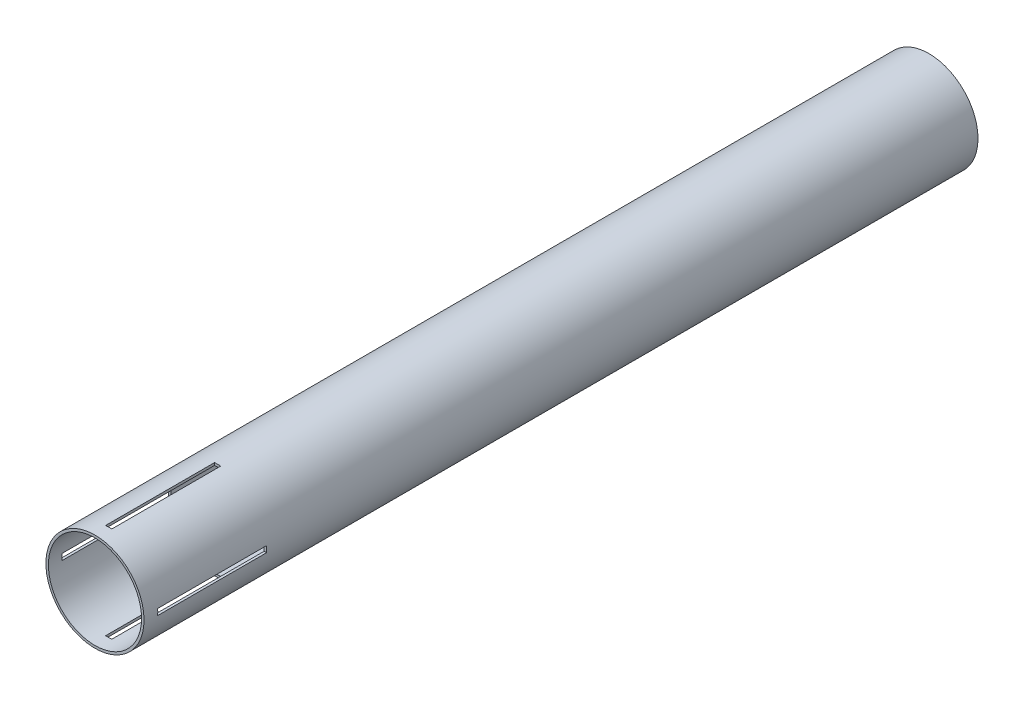
ISO-10303-21;
HEADER;
FILE_DESCRIPTION(('STEP AP214'),'2;1');
FILE_NAME('part.step','',(''),(''),'','','');
FILE_SCHEMA(('AUTOMOTIVE_DESIGN { 1 0 10303 214 1 1 1 1 }'));
ENDSEC;
DATA;
#1=APPLICATION_CONTEXT('core data for automotive mechanical design processes');
#2=APPLICATION_PROTOCOL_DEFINITION('international standard','automotive_design',2000,#1);
#3=PRODUCT_CONTEXT('',#1,'mechanical');
#4=PRODUCT('Part','Part','',(#3));
#5=PRODUCT_RELATED_PRODUCT_CATEGORY('part','',(#4));
#6=PRODUCT_DEFINITION_FORMATION('','',#4);
#7=PRODUCT_DEFINITION_CONTEXT('part definition',#1,'design');
#8=PRODUCT_DEFINITION('design','',#6,#7);
#9=PRODUCT_DEFINITION_SHAPE('','',#8);
#10=(LENGTH_UNIT() NAMED_UNIT(*) SI_UNIT(.MILLI.,.METRE.));
#11=(NAMED_UNIT(*) PLANE_ANGLE_UNIT() SI_UNIT($,.RADIAN.));
#12=(NAMED_UNIT(*) SI_UNIT($,.STERADIAN.) SOLID_ANGLE_UNIT());
#13=UNCERTAINTY_MEASURE_WITH_UNIT(LENGTH_MEASURE(1.E-05),#10,'distance_accuracy_value','');
#14=(GEOMETRIC_REPRESENTATION_CONTEXT(3) GLOBAL_UNCERTAINTY_ASSIGNED_CONTEXT((#13)) GLOBAL_UNIT_ASSIGNED_CONTEXT((#10,
#11,#12)) REPRESENTATION_CONTEXT('',''));
#15=CARTESIAN_POINT('',(0.,0.,0.));
#16=DIRECTION('',(0.,0.,1.));
#17=DIRECTION('',(1.,0.,0.));
#18=AXIS2_PLACEMENT_3D('',#15,#16,#17);
#19=CARTESIAN_POINT('',(-50.7006841669814,-3.175,736.6));
#20=DIRECTION('',(0.,-1.,0.));
#21=DIRECTION('',(0.,0.,-1.));
#22=AXIS2_PLACEMENT_3D('',#19,#20,#21);
#23=PLANE('',#22);
#24=DIRECTION('',(1.,0.,0.));
#25=VECTOR('',#24,1.);
#26=CARTESIAN_POINT('',(-50.7006841669814,-3.175,849.376));
#27=LINE('',#26,#25);
#28=CARTESIAN_POINT('',(-50.7006841669814,-3.175,849.376));
#29=VERTEX_POINT('',#28);
#30=CARTESIAN_POINT('',(-48.1554459537029,-3.175,849.376));
#31=VERTEX_POINT('',#30);
#32=EDGE_CURVE('E60',#29,#31,#27,.T.);
#33=ORIENTED_EDGE('',*,*,#32,.T.);
#34=DIRECTION('',(0.,0.,1.));
#35=VECTOR('',#34,1.);
#36=CARTESIAN_POINT('',(-48.1554459537029,-3.175,736.6));
#37=LINE('',#36,#35);
#38=CARTESIAN_POINT('',(-48.1554459537029,-3.175,736.6));
#39=VERTEX_POINT('',#38);
#40=EDGE_CURVE('E195',#39,#31,#37,.T.);
#41=ORIENTED_EDGE('',*,*,#40,.F.);
#42=DIRECTION('',(1.,0.,0.));
#43=VECTOR('',#42,1.);
#44=CARTESIAN_POINT('',(-50.7006841669814,-3.175,736.6));
#45=LINE('',#44,#43);
#46=CARTESIAN_POINT('',(-50.7006841669814,-3.175,736.6));
#47=VERTEX_POINT('',#46);
#48=EDGE_CURVE('E230',#47,#39,#45,.T.);
#49=ORIENTED_EDGE('',*,*,#48,.F.);
#50=DIRECTION('',(0.,0.,1.));
#51=VECTOR('',#50,1.);
#52=CARTESIAN_POINT('',(-50.7006841669814,-3.175,736.6));
#53=LINE('',#52,#51);
#54=EDGE_CURVE('E55',#47,#29,#53,.T.);
#55=ORIENTED_EDGE('',*,*,#54,.T.);
#56=EDGE_LOOP('',(#33,#41,#49,#55));
#57=FACE_BOUND('',#56,.T.);
#58=ADVANCED_FACE('F39',(#57),#23,.F.);
#59=CARTESIAN_POINT('',(-50.7006841669814,3.175,736.6));
#60=DIRECTION('',(0.,1.,0.));
#61=DIRECTION('',(0.,0.,1.));
#62=AXIS2_PLACEMENT_3D('',#59,#60,#61);
#63=PLANE('',#62);
#64=DIRECTION('',(-1.,0.,0.));
#65=VECTOR('',#64,1.);
#66=CARTESIAN_POINT('',(-48.1554459537029,3.175,849.376));
#67=LINE('',#66,#65);
#68=CARTESIAN_POINT('',(-48.1554459537029,3.175,849.376));
#69=VERTEX_POINT('',#68);
#70=CARTESIAN_POINT('',(-50.7006841669814,3.175,849.376));
#71=VERTEX_POINT('',#70);
#72=EDGE_CURVE('E332',#69,#71,#67,.T.);
#73=ORIENTED_EDGE('',*,*,#72,.T.);
#74=DIRECTION('',(0.,0.,1.));
#75=VECTOR('',#74,1.);
#76=CARTESIAN_POINT('',(-50.7006841669814,3.175,736.6));
#77=LINE('',#76,#75);
#78=CARTESIAN_POINT('',(-50.7006841669814,3.175,736.6));
#79=VERTEX_POINT('',#78);
#80=EDGE_CURVE('E238',#79,#71,#77,.T.);
#81=ORIENTED_EDGE('',*,*,#80,.F.);
#82=DIRECTION('',(-1.,0.,0.));
#83=VECTOR('',#82,1.);
#84=CARTESIAN_POINT('',(-50.7006841669814,3.175,736.6));
#85=LINE('',#84,#83);
#86=CARTESIAN_POINT('',(-48.1554459537029,3.175,736.6));
#87=VERTEX_POINT('',#86);
#88=EDGE_CURVE('E222',#87,#79,#85,.T.);
#89=ORIENTED_EDGE('',*,*,#88,.F.);
#90=DIRECTION('',(0.,0.,1.));
#91=VECTOR('',#90,1.);
#92=CARTESIAN_POINT('',(-48.1554459537029,3.175,736.6));
#93=LINE('',#92,#91);
#94=EDGE_CURVE('E233',#87,#69,#93,.T.);
#95=ORIENTED_EDGE('',*,*,#94,.T.);
#96=EDGE_LOOP('',(#73,#81,#89,#95));
#97=FACE_BOUND('',#96,.T.);
#98=ADVANCED_FACE('F349',(#97),#63,.F.);
#99=CARTESIAN_POINT('',(-3.17500000000001,-48.1554459537029,736.6));
#100=DIRECTION('',(-1.,0.,0.));
#101=DIRECTION('',(0.,-1.,0.));
#102=AXIS2_PLACEMENT_3D('',#99,#100,#101);
#103=PLANE('',#102);
#104=DIRECTION('',(0.,-1.,0.));
#105=VECTOR('',#104,1.);
#106=CARTESIAN_POINT('',(-3.17500000000001,-48.1554459537029,849.376));
#107=LINE('',#106,#105);
#108=CARTESIAN_POINT('',(-3.17500000000001,-48.1554459537029,849.376));
#109=VERTEX_POINT('',#108);
#110=CARTESIAN_POINT('',(-3.17500000000001,-50.7006841669814,849.376));
#111=VERTEX_POINT('',#110);
#112=EDGE_CURVE('E315',#109,#111,#107,.T.);
#113=ORIENTED_EDGE('',*,*,#112,.T.);
#114=DIRECTION('',(0.,0.,1.));
#115=VECTOR('',#114,1.);
#116=CARTESIAN_POINT('',(-3.17500000000001,-50.7006841669814,736.6));
#117=LINE('',#116,#115);
#118=CARTESIAN_POINT('',(-3.17500000000001,-50.7006841669814,736.6));
#119=VERTEX_POINT('',#118);
#120=EDGE_CURVE('E279',#119,#111,#117,.T.);
#121=ORIENTED_EDGE('',*,*,#120,.F.);
#122=DIRECTION('',(0.,-1.,0.));
#123=VECTOR('',#122,1.);
#124=CARTESIAN_POINT('',(-3.17500000000001,-48.1554459537029,736.6));
#125=LINE('',#124,#123);
#126=CARTESIAN_POINT('',(-3.17500000000001,-48.1554459537029,736.6));
#127=VERTEX_POINT('',#126);
#128=EDGE_CURVE('E171',#127,#119,#125,.T.);
#129=ORIENTED_EDGE('',*,*,#128,.F.);
#130=DIRECTION('',(0.,0.,1.));
#131=VECTOR('',#130,1.);
#132=CARTESIAN_POINT('',(-3.17500000000001,-48.1554459537029,736.6));
#133=LINE('',#132,#131);
#134=EDGE_CURVE('E185',#127,#109,#133,.T.);
#135=ORIENTED_EDGE('',*,*,#134,.T.);
#136=EDGE_LOOP('',(#113,#121,#129,#135));
#137=FACE_BOUND('',#136,.T.);
#138=ADVANCED_FACE('F359',(#137),#103,.F.);
#139=CARTESIAN_POINT('',(3.17500000000001,-48.1554459537029,736.6));
#140=DIRECTION('',(1.,0.,0.));
#141=DIRECTION('',(0.,1.,0.));
#142=AXIS2_PLACEMENT_3D('',#139,#140,#141);
#143=PLANE('',#142);
#144=DIRECTION('',(0.,1.,0.));
#145=VECTOR('',#144,1.);
#146=CARTESIAN_POINT('',(3.17500000000001,-50.7006841669814,849.376));
#147=LINE('',#146,#145);
#148=CARTESIAN_POINT('',(3.17500000000001,-50.7006841669814,849.376));
#149=VERTEX_POINT('',#148);
#150=CARTESIAN_POINT('',(3.175,-48.1554459537029,849.376));
#151=VERTEX_POINT('',#150);
#152=EDGE_CURVE('E322',#149,#151,#147,.T.);
#153=ORIENTED_EDGE('',*,*,#152,.T.);
#154=DIRECTION('',(0.,0.,1.));
#155=VECTOR('',#154,1.);
#156=CARTESIAN_POINT('',(3.175,-48.1554459537029,736.6));
#157=LINE('',#156,#155);
#158=CARTESIAN_POINT('',(3.175,-48.1554459537029,736.6));
#159=VERTEX_POINT('',#158);
#160=EDGE_CURVE('E160',#159,#151,#157,.T.);
#161=ORIENTED_EDGE('',*,*,#160,.F.);
#162=DIRECTION('',(0.,1.,0.));
#163=VECTOR('',#162,1.);
#164=CARTESIAN_POINT('',(3.17500000000001,-48.1554459537029,736.6));
#165=LINE('',#164,#163);
#166=CARTESIAN_POINT('',(3.17500000000001,-50.7006841669814,736.6));
#167=VERTEX_POINT('',#166);
#168=EDGE_CURVE('E153',#167,#159,#165,.T.);
#169=ORIENTED_EDGE('',*,*,#168,.F.);
#170=DIRECTION('',(0.,0.,1.));
#171=VECTOR('',#170,1.);
#172=CARTESIAN_POINT('',(3.17500000000001,-50.7006841669814,736.6));
#173=LINE('',#172,#171);
#174=EDGE_CURVE('E157',#167,#149,#173,.T.);
#175=ORIENTED_EDGE('',*,*,#174,.T.);
#176=EDGE_LOOP('',(#153,#161,#169,#175));
#177=FACE_BOUND('',#176,.T.);
#178=ADVANCED_FACE('F155',(#177),#143,.F.);
#179=CARTESIAN_POINT('',(48.1554459537029,-3.175,736.6));
#180=DIRECTION('',(0.,-1.,0.));
#181=DIRECTION('',(0.,0.,-1.));
#182=AXIS2_PLACEMENT_3D('',#179,#180,#181);
#183=PLANE('',#182);
#184=DIRECTION('',(1.,0.,0.));
#185=VECTOR('',#184,1.);
#186=CARTESIAN_POINT('',(48.1554459537029,-3.17500000000002,849.376));
#187=LINE('',#186,#185);
#188=CARTESIAN_POINT('',(48.1554459537029,-3.17500000000002,849.376));
#189=VERTEX_POINT('',#188);
#190=CARTESIAN_POINT('',(50.7006841669814,-3.175,849.376));
#191=VERTEX_POINT('',#190);
#192=EDGE_CURVE('E301',#189,#191,#187,.T.);
#193=ORIENTED_EDGE('',*,*,#192,.T.);
#194=DIRECTION('',(0.,0.,1.));
#195=VECTOR('',#194,1.);
#196=CARTESIAN_POINT('',(50.7006841669814,-3.175,736.6));
#197=LINE('',#196,#195);
#198=CARTESIAN_POINT('',(50.7006841669814,-3.175,736.6));
#199=VERTEX_POINT('',#198);
#200=EDGE_CURVE('E223',#199,#191,#197,.T.);
#201=ORIENTED_EDGE('',*,*,#200,.F.);
#202=DIRECTION('',(1.,0.,0.));
#203=VECTOR('',#202,1.);
#204=CARTESIAN_POINT('',(48.1554459537029,-3.175,736.6));
#205=LINE('',#204,#203);
#206=CARTESIAN_POINT('',(48.1554459537029,-3.17500000000002,736.6));
#207=VERTEX_POINT('',#206);
#208=EDGE_CURVE('E255',#207,#199,#205,.T.);
#209=ORIENTED_EDGE('',*,*,#208,.F.);
#210=DIRECTION('',(0.,0.,1.));
#211=VECTOR('',#210,1.);
#212=CARTESIAN_POINT('',(48.1554459537029,-3.17500000000002,736.6));
#213=LINE('',#212,#211);
#214=EDGE_CURVE('E263',#207,#189,#213,.T.);
#215=ORIENTED_EDGE('',*,*,#214,.T.);
#216=EDGE_LOOP('',(#193,#201,#209,#215));
#217=FACE_BOUND('',#216,.T.);
#218=ADVANCED_FACE('F368',(#217),#183,.F.);
#219=CARTESIAN_POINT('',(48.1554459537029,3.175,736.6));
#220=DIRECTION('',(0.,1.,0.));
#221=DIRECTION('',(0.,0.,1.));
#222=AXIS2_PLACEMENT_3D('',#219,#220,#221);
#223=PLANE('',#222);
#224=DIRECTION('',(-1.,0.,0.));
#225=VECTOR('',#224,1.);
#226=CARTESIAN_POINT('',(50.7006841669814,3.175,849.376));
#227=LINE('',#226,#225);
#228=CARTESIAN_POINT('',(50.7006841669814,3.175,849.376));
#229=VERTEX_POINT('',#228);
#230=CARTESIAN_POINT('',(48.1554459537029,3.175,849.376));
#231=VERTEX_POINT('',#230);
#232=EDGE_CURVE('E308',#229,#231,#227,.T.);
#233=ORIENTED_EDGE('',*,*,#232,.T.);
#234=DIRECTION('',(0.,0.,1.));
#235=VECTOR('',#234,1.);
#236=CARTESIAN_POINT('',(48.1554459537029,3.175,736.6));
#237=LINE('',#236,#235);
#238=CARTESIAN_POINT('',(48.1554459537029,3.175,736.6));
#239=VERTEX_POINT('',#238);
#240=EDGE_CURVE('E266',#239,#231,#237,.T.);
#241=ORIENTED_EDGE('',*,*,#240,.F.);
#242=DIRECTION('',(-1.,0.,0.));
#243=VECTOR('',#242,1.);
#244=CARTESIAN_POINT('',(48.1554459537029,3.175,736.6));
#245=LINE('',#244,#243);
#246=CARTESIAN_POINT('',(50.7006841669814,3.175,736.6));
#247=VERTEX_POINT('',#246);
#248=EDGE_CURVE('E248',#247,#239,#245,.T.);
#249=ORIENTED_EDGE('',*,*,#248,.F.);
#250=DIRECTION('',(0.,0.,1.));
#251=VECTOR('',#250,1.);
#252=CARTESIAN_POINT('',(50.7006841669814,3.175,736.6));
#253=LINE('',#252,#251);
#254=EDGE_CURVE('E259',#247,#229,#253,.T.);
#255=ORIENTED_EDGE('',*,*,#254,.T.);
#256=EDGE_LOOP('',(#233,#241,#249,#255));
#257=FACE_BOUND('',#256,.T.);
#258=ADVANCED_FACE('F371',(#257),#223,.F.);
#259=CARTESIAN_POINT('',(3.175,50.7006841669814,736.6));
#260=DIRECTION('',(1.,0.,0.));
#261=DIRECTION('',(0.,1.,0.));
#262=AXIS2_PLACEMENT_3D('',#259,#260,#261);
#263=PLANE('',#262);
#264=DIRECTION('',(0.,1.,0.));
#265=VECTOR('',#264,1.);
#266=CARTESIAN_POINT('',(3.175,48.1554459537029,849.376));
#267=LINE('',#266,#265);
#268=CARTESIAN_POINT('',(3.175,48.1554459537029,849.376));
#269=VERTEX_POINT('',#268);
#270=CARTESIAN_POINT('',(3.175,50.7006841669814,849.376));
#271=VERTEX_POINT('',#270);
#272=EDGE_CURVE('E249',#269,#271,#267,.T.);
#273=ORIENTED_EDGE('',*,*,#272,.T.);
#274=DIRECTION('',(0.,0.,1.));
#275=VECTOR('',#274,1.);
#276=CARTESIAN_POINT('',(3.175,50.7006841669814,736.6));
#277=LINE('',#276,#275);
#278=CARTESIAN_POINT('',(3.175,50.7006841669814,736.6));
#279=VERTEX_POINT('',#278);
#280=EDGE_CURVE('E175',#279,#271,#277,.T.);
#281=ORIENTED_EDGE('',*,*,#280,.F.);
#282=DIRECTION('',(0.,1.,0.));
#283=VECTOR('',#282,1.);
#284=CARTESIAN_POINT('',(3.175,50.7006841669814,736.6));
#285=LINE('',#284,#283);
#286=CARTESIAN_POINT('',(3.175,48.1554459537029,736.6));
#287=VERTEX_POINT('',#286);
#288=EDGE_CURVE('E201',#287,#279,#285,.T.);
#289=ORIENTED_EDGE('',*,*,#288,.F.);
#290=DIRECTION('',(0.,0.,1.));
#291=VECTOR('',#290,1.);
#292=CARTESIAN_POINT('',(3.175,48.1554459537029,736.6));
#293=LINE('',#292,#291);
#294=EDGE_CURVE('E209',#287,#269,#293,.T.);
#295=ORIENTED_EDGE('',*,*,#294,.T.);
#296=EDGE_LOOP('',(#273,#281,#289,#295));
#297=FACE_BOUND('',#296,.T.);
#298=ADVANCED_FACE('F375',(#297),#263,.F.);
#299=CARTESIAN_POINT('',(-3.175,50.7006841669814,736.6));
#300=DIRECTION('',(-1.,0.,0.));
#301=DIRECTION('',(0.,-1.,0.));
#302=AXIS2_PLACEMENT_3D('',#299,#300,#301);
#303=PLANE('',#302);
#304=DIRECTION('',(0.,-1.,0.));
#305=VECTOR('',#304,1.);
#306=CARTESIAN_POINT('',(-3.175,50.7006841669814,849.376));
#307=LINE('',#306,#305);
#308=CARTESIAN_POINT('',(-3.175,50.7006841669814,849.376));
#309=VERTEX_POINT('',#308);
#310=CARTESIAN_POINT('',(-3.175,48.1554459537029,849.376));
#311=VERTEX_POINT('',#310);
#312=EDGE_CURVE('E294',#309,#311,#307,.T.);
#313=ORIENTED_EDGE('',*,*,#312,.T.);
#314=DIRECTION('',(0.,0.,1.));
#315=VECTOR('',#314,1.);
#316=CARTESIAN_POINT('',(-3.175,48.1554459537029,736.6));
#317=LINE('',#316,#315);
#318=CARTESIAN_POINT('',(-3.175,48.1554459537029,736.6));
#319=VERTEX_POINT('',#318);
#320=EDGE_CURVE('E212',#319,#311,#317,.T.);
#321=ORIENTED_EDGE('',*,*,#320,.F.);
#322=DIRECTION('',(0.,-1.,0.));
#323=VECTOR('',#322,1.);
#324=CARTESIAN_POINT('',(-3.175,50.7006841669814,736.6));
#325=LINE('',#324,#323);
#326=CARTESIAN_POINT('',(-3.175,50.7006841669814,736.6));
#327=VERTEX_POINT('',#326);
#328=EDGE_CURVE('E194',#327,#319,#325,.T.);
#329=ORIENTED_EDGE('',*,*,#328,.F.);
#330=DIRECTION('',(0.,0.,1.));
#331=VECTOR('',#330,1.);
#332=CARTESIAN_POINT('',(-3.175,50.7006841669814,736.6));
#333=LINE('',#332,#331);
#334=EDGE_CURVE('E205',#327,#309,#333,.T.);
#335=ORIENTED_EDGE('',*,*,#334,.T.);
#336=EDGE_LOOP('',(#313,#321,#329,#335));
#337=FACE_BOUND('',#336,.T.);
#338=ADVANCED_FACE('F383',(#337),#303,.F.);
#339=CARTESIAN_POINT('',(0.,0.,863.6));
#340=DIRECTION('',(0.,0.,1.));
#341=DIRECTION('',(1.,0.,0.));
#342=AXIS2_PLACEMENT_3D('',#339,#340,#341);
#343=PLANE('',#342);
#344=CARTESIAN_POINT('',(0.,0.,863.6));
#345=DIRECTION('',(0.,0.,1.));
#346=DIRECTION('',(1.,0.,0.));
#347=AXIS2_PLACEMENT_3D('',#344,#345,#346);
#348=CIRCLE('',#347,48.26);
#349=CARTESIAN_POINT('',(48.26,0.,863.6));
#350=VERTEX_POINT('',#349);
#351=EDGE_CURVE('E272',#350,#350,#348,.T.);
#352=ORIENTED_EDGE('',*,*,#351,.F.);
#353=EDGE_LOOP('',(#352));
#354=FACE_BOUND('',#353,.T.);
#355=CARTESIAN_POINT('',(0.,0.,863.6));
#356=DIRECTION('',(0.,0.,1.));
#357=DIRECTION('',(1.,0.,0.));
#358=AXIS2_PLACEMENT_3D('',#355,#356,#357);
#359=CIRCLE('',#358,50.8);
#360=CARTESIAN_POINT('',(50.8,0.,863.6));
#361=VERTEX_POINT('',#360);
#362=EDGE_CURVE('E11',#361,#361,#359,.T.);
#363=ORIENTED_EDGE('',*,*,#362,.T.);
#364=EDGE_LOOP('',(#363));
#365=FACE_BOUND('',#364,.T.);
#366=ADVANCED_FACE('F380',(#354,#365),#343,.T.);
#367=CARTESIAN_POINT('',(0.,0.,0.));
#368=DIRECTION('',(0.,0.,1.));
#369=DIRECTION('',(1.,0.,0.));
#370=AXIS2_PLACEMENT_3D('',#367,#368,#369);
#371=PLANE('',#370);
#372=CARTESIAN_POINT('',(0.,0.,0.));
#373=DIRECTION('',(0.,0.,1.));
#374=DIRECTION('',(1.,0.,0.));
#375=AXIS2_PLACEMENT_3D('',#372,#373,#374);
#376=CIRCLE('',#375,50.8);
#377=CARTESIAN_POINT('',(50.8,0.,0.));
#378=VERTEX_POINT('',#377);
#379=EDGE_CURVE('E43',#378,#378,#376,.T.);
#380=ORIENTED_EDGE('',*,*,#379,.F.);
#381=EDGE_LOOP('',(#380));
#382=FACE_BOUND('',#381,.T.);
#383=CARTESIAN_POINT('',(0.,0.,0.));
#384=DIRECTION('',(0.,0.,1.));
#385=DIRECTION('',(1.,0.,0.));
#386=AXIS2_PLACEMENT_3D('',#383,#384,#385);
#387=CIRCLE('',#386,48.26);
#388=CARTESIAN_POINT('',(48.26,0.,0.));
#389=VERTEX_POINT('',#388);
#390=EDGE_CURVE('E276',#389,#389,#387,.T.);
#391=ORIENTED_EDGE('',*,*,#390,.T.);
#392=EDGE_LOOP('',(#391));
#393=FACE_BOUND('',#392,.T.);
#394=ADVANCED_FACE('F382',(#382,#393),#371,.F.);
#395=CARTESIAN_POINT('',(0.,0.,863.6));
#396=DIRECTION('',(0.,0.,-1.));
#397=DIRECTION('',(-1.,0.,0.));
#398=AXIS2_PLACEMENT_3D('',#395,#396,#397);
#399=CYLINDRICAL_SURFACE('',#398,50.8);
#400=ORIENTED_EDGE('',*,*,#362,.F.);
#401=EDGE_LOOP('',(#400));
#402=FACE_BOUND('',#401,.T.);
#403=CARTESIAN_POINT('',(0.,0.,849.376));
#404=DIRECTION('',(0.,0.,1.));
#405=DIRECTION('',(1.,0.,0.));
#406=AXIS2_PLACEMENT_3D('',#403,#404,#405);
#407=CIRCLE('',#406,50.8);
#408=EDGE_CURVE('E329',#71,#29,#407,.T.);
#409=ORIENTED_EDGE('',*,*,#408,.T.);
#410=ORIENTED_EDGE('',*,*,#54,.F.);
#411=CARTESIAN_POINT('',(0.,0.,736.6));
#412=DIRECTION('',(0.,0.,1.));
#413=DIRECTION('',(1.,0.,0.));
#414=AXIS2_PLACEMENT_3D('',#411,#412,#413);
#415=CIRCLE('',#414,50.8);
#416=EDGE_CURVE('E227',#79,#47,#415,.T.);
#417=ORIENTED_EDGE('',*,*,#416,.F.);
#418=ORIENTED_EDGE('',*,*,#80,.T.);
#419=EDGE_LOOP('',(#409,#410,#417,#418));
#420=FACE_BOUND('',#419,.T.);
#421=ORIENTED_EDGE('',*,*,#120,.T.);
#422=CARTESIAN_POINT('',(0.,0.,849.376));
#423=DIRECTION('',(0.,0.,1.));
#424=DIRECTION('',(1.,0.,0.));
#425=AXIS2_PLACEMENT_3D('',#422,#423,#424);
#426=CIRCLE('',#425,50.8);
#427=EDGE_CURVE('E180',#111,#149,#426,.T.);
#428=ORIENTED_EDGE('',*,*,#427,.T.);
#429=ORIENTED_EDGE('',*,*,#174,.F.);
#430=CARTESIAN_POINT('',(0.,0.,736.6));
#431=DIRECTION('',(0.,0.,1.));
#432=DIRECTION('',(1.,0.,0.));
#433=AXIS2_PLACEMENT_3D('',#430,#431,#432);
#434=CIRCLE('',#433,50.8);
#435=EDGE_CURVE('E165',#119,#167,#434,.T.);
#436=ORIENTED_EDGE('',*,*,#435,.F.);
#437=EDGE_LOOP('',(#421,#428,#429,#436));
#438=FACE_BOUND('',#437,.T.);
#439=ORIENTED_EDGE('',*,*,#200,.T.);
#440=CARTESIAN_POINT('',(0.,0.,849.376));
#441=DIRECTION('',(0.,0.,1.));
#442=DIRECTION('',(1.,0.,0.));
#443=AXIS2_PLACEMENT_3D('',#440,#441,#442);
#444=CIRCLE('',#443,50.8);
#445=EDGE_CURVE('E311',#191,#229,#444,.T.);
#446=ORIENTED_EDGE('',*,*,#445,.T.);
#447=ORIENTED_EDGE('',*,*,#254,.F.);
#448=CARTESIAN_POINT('',(0.,0.,736.6));
#449=DIRECTION('',(0.,0.,1.));
#450=DIRECTION('',(1.,0.,0.));
#451=AXIS2_PLACEMENT_3D('',#448,#449,#450);
#452=CIRCLE('',#451,50.8);
#453=EDGE_CURVE('E244',#199,#247,#452,.T.);
#454=ORIENTED_EDGE('',*,*,#453,.F.);
#455=EDGE_LOOP('',(#439,#446,#447,#454));
#456=FACE_BOUND('',#455,.T.);
#457=ORIENTED_EDGE('',*,*,#280,.T.);
#458=CARTESIAN_POINT('',(0.,0.,849.376));
#459=DIRECTION('',(0.,0.,1.));
#460=DIRECTION('',(1.,0.,0.));
#461=AXIS2_PLACEMENT_3D('',#458,#459,#460);
#462=CIRCLE('',#461,50.8);
#463=EDGE_CURVE('E297',#271,#309,#462,.T.);
#464=ORIENTED_EDGE('',*,*,#463,.T.);
#465=ORIENTED_EDGE('',*,*,#334,.F.);
#466=CARTESIAN_POINT('',(0.,0.,736.6));
#467=DIRECTION('',(0.,0.,1.));
#468=DIRECTION('',(1.,0.,0.));
#469=AXIS2_PLACEMENT_3D('',#466,#467,#468);
#470=CIRCLE('',#469,50.8);
#471=EDGE_CURVE('E190',#279,#327,#470,.T.);
#472=ORIENTED_EDGE('',*,*,#471,.F.);
#473=EDGE_LOOP('',(#457,#464,#465,#472));
#474=FACE_BOUND('',#473,.T.);
#475=ORIENTED_EDGE('',*,*,#379,.T.);
#476=EDGE_LOOP('',(#475));
#477=FACE_BOUND('',#476,.T.);
#478=ADVANCED_FACE('F41',(#402,#420,#438,#456,#474,#477),#399,.T.);
#479=CARTESIAN_POINT('',(0.,0.,863.6));
#480=DIRECTION('',(0.,0.,-1.));
#481=DIRECTION('',(-1.,0.,0.));
#482=AXIS2_PLACEMENT_3D('',#479,#480,#481);
#483=CYLINDRICAL_SURFACE('',#482,48.26);
#484=ORIENTED_EDGE('',*,*,#351,.T.);
#485=EDGE_LOOP('',(#484));
#486=FACE_BOUND('',#485,.T.);
#487=ORIENTED_EDGE('',*,*,#40,.T.);
#488=CARTESIAN_POINT('',(0.,0.,849.376));
#489=DIRECTION('',(0.,0.,-1.));
#490=DIRECTION('',(1.,0.,0.));
#491=AXIS2_PLACEMENT_3D('',#488,#489,#490);
#492=CIRCLE('',#491,48.26);
#493=EDGE_CURVE('E335',#31,#69,#492,.T.);
#494=ORIENTED_EDGE('',*,*,#493,.T.);
#495=ORIENTED_EDGE('',*,*,#94,.F.);
#496=CARTESIAN_POINT('',(0.,0.,736.6));
#497=DIRECTION('',(0.,0.,-1.));
#498=DIRECTION('',(1.,0.,0.));
#499=AXIS2_PLACEMENT_3D('',#496,#497,#498);
#500=CIRCLE('',#499,48.26);
#501=EDGE_CURVE('E218',#39,#87,#500,.T.);
#502=ORIENTED_EDGE('',*,*,#501,.F.);
#503=EDGE_LOOP('',(#487,#494,#495,#502));
#504=FACE_BOUND('',#503,.T.);
#505=ORIENTED_EDGE('',*,*,#160,.T.);
#506=CARTESIAN_POINT('',(0.,0.,849.376));
#507=DIRECTION('',(0.,0.,-1.));
#508=DIRECTION('',(1.,0.,0.));
#509=AXIS2_PLACEMENT_3D('',#506,#507,#508);
#510=CIRCLE('',#509,48.26);
#511=EDGE_CURVE('E318',#151,#109,#510,.T.);
#512=ORIENTED_EDGE('',*,*,#511,.T.);
#513=ORIENTED_EDGE('',*,*,#134,.F.);
#514=CARTESIAN_POINT('',(0.,0.,736.6));
#515=DIRECTION('',(0.,0.,-1.));
#516=DIRECTION('',(1.,0.,0.));
#517=AXIS2_PLACEMENT_3D('',#514,#515,#516);
#518=CIRCLE('',#517,48.26);
#519=EDGE_CURVE('E164',#159,#127,#518,.T.);
#520=ORIENTED_EDGE('',*,*,#519,.F.);
#521=EDGE_LOOP('',(#505,#512,#513,#520));
#522=FACE_BOUND('',#521,.T.);
#523=CARTESIAN_POINT('',(0.,0.,849.376));
#524=DIRECTION('',(0.,0.,-1.));
#525=DIRECTION('',(1.,0.,0.));
#526=AXIS2_PLACEMENT_3D('',#523,#524,#525);
#527=CIRCLE('',#526,48.26);
#528=EDGE_CURVE('E304',#231,#189,#527,.T.);
#529=ORIENTED_EDGE('',*,*,#528,.T.);
#530=ORIENTED_EDGE('',*,*,#214,.F.);
#531=CARTESIAN_POINT('',(0.,0.,736.6));
#532=DIRECTION('',(0.,0.,-1.));
#533=DIRECTION('',(1.,0.,0.));
#534=AXIS2_PLACEMENT_3D('',#531,#532,#533);
#535=CIRCLE('',#534,48.26);
#536=EDGE_CURVE('E252',#239,#207,#535,.T.);
#537=ORIENTED_EDGE('',*,*,#536,.F.);
#538=ORIENTED_EDGE('',*,*,#240,.T.);
#539=EDGE_LOOP('',(#529,#530,#537,#538));
#540=FACE_BOUND('',#539,.T.);
#541=CARTESIAN_POINT('',(0.,0.,849.376));
#542=DIRECTION('',(0.,0.,-1.));
#543=DIRECTION('',(1.,0.,0.));
#544=AXIS2_PLACEMENT_3D('',#541,#542,#543);
#545=CIRCLE('',#544,48.26);
#546=EDGE_CURVE('E290',#311,#269,#545,.T.);
#547=ORIENTED_EDGE('',*,*,#546,.T.);
#548=ORIENTED_EDGE('',*,*,#294,.F.);
#549=CARTESIAN_POINT('',(0.,0.,736.6));
#550=DIRECTION('',(0.,0.,-1.));
#551=DIRECTION('',(1.,0.,0.));
#552=AXIS2_PLACEMENT_3D('',#549,#550,#551);
#553=CIRCLE('',#552,48.26);
#554=EDGE_CURVE('E198',#319,#287,#553,.T.);
#555=ORIENTED_EDGE('',*,*,#554,.F.);
#556=ORIENTED_EDGE('',*,*,#320,.T.);
#557=EDGE_LOOP('',(#547,#548,#555,#556));
#558=FACE_BOUND('',#557,.T.);
#559=ORIENTED_EDGE('',*,*,#390,.F.);
#560=EDGE_LOOP('',(#559));
#561=FACE_BOUND('',#560,.T.);
#562=ADVANCED_FACE('F341',(#486,#504,#522,#540,#558,#561),#483,.F.);
#563=CARTESIAN_POINT('',(0.,0.,736.6));
#564=DIRECTION('',(0.,0.,1.));
#565=DIRECTION('',(1.,0.,0.));
#566=AXIS2_PLACEMENT_3D('',#563,#564,#565);
#567=PLANE('',#566);
#568=ORIENTED_EDGE('',*,*,#453,.T.);
#569=ORIENTED_EDGE('',*,*,#248,.T.);
#570=ORIENTED_EDGE('',*,*,#536,.T.);
#571=ORIENTED_EDGE('',*,*,#208,.T.);
#572=EDGE_LOOP('',(#568,#569,#570,#571));
#573=FACE_BOUND('',#572,.T.);
#574=ADVANCED_FACE('F364',(#573),#567,.T.);
#575=CARTESIAN_POINT('',(0.,0.,736.6));
#576=DIRECTION('',(0.,0.,1.));
#577=DIRECTION('',(1.,0.,0.));
#578=AXIS2_PLACEMENT_3D('',#575,#576,#577);
#579=PLANE('',#578);
#580=ORIENTED_EDGE('',*,*,#501,.T.);
#581=ORIENTED_EDGE('',*,*,#88,.T.);
#582=ORIENTED_EDGE('',*,*,#416,.T.);
#583=ORIENTED_EDGE('',*,*,#48,.T.);
#584=EDGE_LOOP('',(#580,#581,#582,#583));
#585=FACE_BOUND('',#584,.T.);
#586=ADVANCED_FACE('F353',(#585),#579,.T.);
#587=CARTESIAN_POINT('',(0.,0.,736.6));
#588=DIRECTION('',(0.,0.,1.));
#589=DIRECTION('',(1.,0.,0.));
#590=AXIS2_PLACEMENT_3D('',#587,#588,#589);
#591=PLANE('',#590);
#592=ORIENTED_EDGE('',*,*,#471,.T.);
#593=ORIENTED_EDGE('',*,*,#328,.T.);
#594=ORIENTED_EDGE('',*,*,#554,.T.);
#595=ORIENTED_EDGE('',*,*,#288,.T.);
#596=EDGE_LOOP('',(#592,#593,#594,#595));
#597=FACE_BOUND('',#596,.T.);
#598=ADVANCED_FACE('F415',(#597),#591,.T.);
#599=CARTESIAN_POINT('',(0.,0.,736.6));
#600=DIRECTION('',(0.,0.,1.));
#601=DIRECTION('',(1.,0.,0.));
#602=AXIS2_PLACEMENT_3D('',#599,#600,#601);
#603=PLANE('',#602);
#604=ORIENTED_EDGE('',*,*,#435,.T.);
#605=ORIENTED_EDGE('',*,*,#168,.T.);
#606=ORIENTED_EDGE('',*,*,#519,.T.);
#607=ORIENTED_EDGE('',*,*,#128,.T.);
#608=EDGE_LOOP('',(#604,#605,#606,#607));
#609=FACE_BOUND('',#608,.T.);
#610=ADVANCED_FACE('F169',(#609),#603,.T.);
#611=CARTESIAN_POINT('',(0.,0.,849.376));
#612=DIRECTION('',(0.,0.,1.));
#613=DIRECTION('',(1.,0.,0.));
#614=AXIS2_PLACEMENT_3D('',#611,#612,#613);
#615=PLANE('',#614);
#616=ORIENTED_EDGE('',*,*,#463,.F.);
#617=ORIENTED_EDGE('',*,*,#272,.F.);
#618=ORIENTED_EDGE('',*,*,#546,.F.);
#619=ORIENTED_EDGE('',*,*,#312,.F.);
#620=EDGE_LOOP('',(#616,#617,#618,#619));
#621=FACE_BOUND('',#620,.T.);
#622=ADVANCED_FACE('F428',(#621),#615,.F.);
#623=CARTESIAN_POINT('',(0.,0.,849.376));
#624=DIRECTION('',(0.,0.,1.));
#625=DIRECTION('',(1.,0.,0.));
#626=AXIS2_PLACEMENT_3D('',#623,#624,#625);
#627=PLANE('',#626);
#628=ORIENTED_EDGE('',*,*,#445,.F.);
#629=ORIENTED_EDGE('',*,*,#192,.F.);
#630=ORIENTED_EDGE('',*,*,#528,.F.);
#631=ORIENTED_EDGE('',*,*,#232,.F.);
#632=EDGE_LOOP('',(#628,#629,#630,#631));
#633=FACE_BOUND('',#632,.T.);
#634=ADVANCED_FACE('F434',(#633),#627,.F.);
#635=CARTESIAN_POINT('',(0.,0.,849.376));
#636=DIRECTION('',(0.,0.,1.));
#637=DIRECTION('',(1.,0.,0.));
#638=AXIS2_PLACEMENT_3D('',#635,#636,#637);
#639=PLANE('',#638);
#640=ORIENTED_EDGE('',*,*,#427,.F.);
#641=ORIENTED_EDGE('',*,*,#112,.F.);
#642=ORIENTED_EDGE('',*,*,#511,.F.);
#643=ORIENTED_EDGE('',*,*,#152,.F.);
#644=EDGE_LOOP('',(#640,#641,#642,#643));
#645=FACE_BOUND('',#644,.T.);
#646=ADVANCED_FACE('F442',(#645),#639,.F.);
#647=CARTESIAN_POINT('',(0.,0.,849.376));
#648=DIRECTION('',(0.,0.,1.));
#649=DIRECTION('',(1.,0.,0.));
#650=AXIS2_PLACEMENT_3D('',#647,#648,#649);
#651=PLANE('',#650);
#652=ORIENTED_EDGE('',*,*,#493,.F.);
#653=ORIENTED_EDGE('',*,*,#32,.F.);
#654=ORIENTED_EDGE('',*,*,#408,.F.);
#655=ORIENTED_EDGE('',*,*,#72,.F.);
#656=EDGE_LOOP('',(#652,#653,#654,#655));
#657=FACE_BOUND('',#656,.T.);
#658=ADVANCED_FACE('F346',(#657),#651,.F.);
#659=CLOSED_SHELL('',(#58,#98,#138,#178,#218,#258,#298,#338,#366,#394,#478,#562,#574,#586,#598,
#610,#622,#634,#646,#658));
#660=MANIFOLD_SOLID_BREP('B2',#659);
#661=ADVANCED_BREP_SHAPE_REPRESENTATION('',(#18,#660),#14);
#662=SHAPE_DEFINITION_REPRESENTATION(#9,#661);
ENDSEC;
END-ISO-10303-21;
